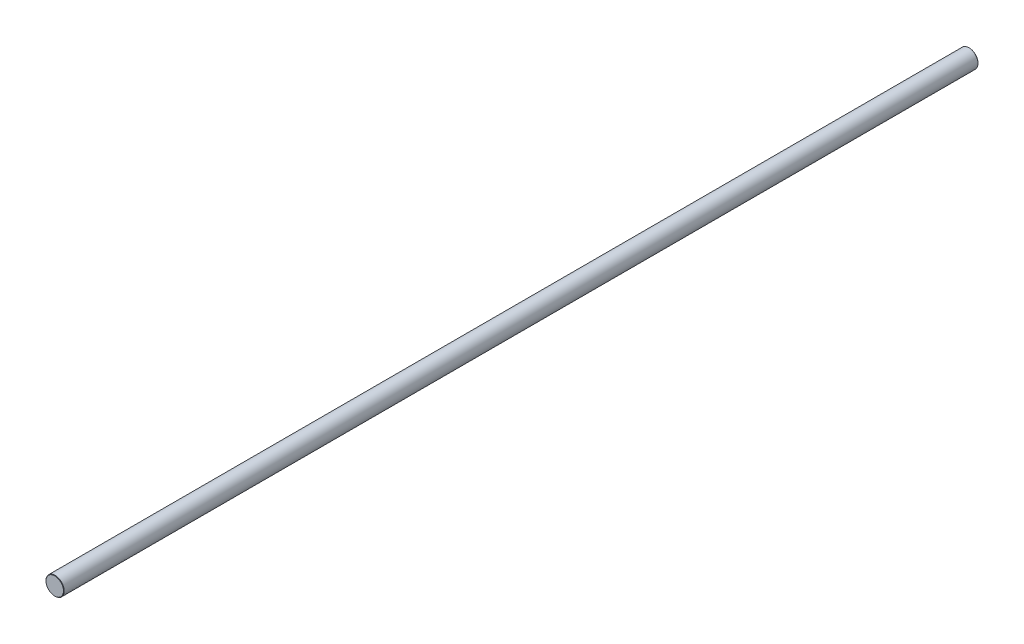
ISO-10303-21;
HEADER;
FILE_DESCRIPTION(('STEP AP214'),'2;1');
FILE_NAME('part.step','',(''),(''),'','','');
FILE_SCHEMA(('AUTOMOTIVE_DESIGN { 1 0 10303 214 1 1 1 1 }'));
ENDSEC;
DATA;
#1=APPLICATION_CONTEXT('core data for automotive mechanical design processes');
#2=APPLICATION_PROTOCOL_DEFINITION('international standard','automotive_design',2000,#1);
#3=PRODUCT_CONTEXT('',#1,'mechanical');
#4=PRODUCT('Part','Part','',(#3));
#5=PRODUCT_RELATED_PRODUCT_CATEGORY('part','',(#4));
#6=PRODUCT_DEFINITION_FORMATION('','',#4);
#7=PRODUCT_DEFINITION_CONTEXT('part definition',#1,'design');
#8=PRODUCT_DEFINITION('design','',#6,#7);
#9=PRODUCT_DEFINITION_SHAPE('','',#8);
#10=(LENGTH_UNIT() NAMED_UNIT(*) SI_UNIT(.MILLI.,.METRE.));
#11=(NAMED_UNIT(*) PLANE_ANGLE_UNIT() SI_UNIT($,.RADIAN.));
#12=(NAMED_UNIT(*) SI_UNIT($,.STERADIAN.) SOLID_ANGLE_UNIT());
#13=UNCERTAINTY_MEASURE_WITH_UNIT(LENGTH_MEASURE(1.E-05),#10,'distance_accuracy_value','');
#14=(GEOMETRIC_REPRESENTATION_CONTEXT(3) GLOBAL_UNCERTAINTY_ASSIGNED_CONTEXT((#13)) GLOBAL_UNIT_ASSIGNED_CONTEXT((#10,
#11,#12)) REPRESENTATION_CONTEXT('',''));
#15=CARTESIAN_POINT('',(0.,0.,0.));
#16=DIRECTION('',(0.,0.,1.));
#17=DIRECTION('',(1.,0.,0.));
#18=AXIS2_PLACEMENT_3D('',#15,#16,#17);
#19=CARTESIAN_POINT('',(0.,0.,1276.));
#20=DIRECTION('',(0.,0.,-1.));
#21=DIRECTION('',(-1.,0.,0.));
#22=AXIS2_PLACEMENT_3D('',#19,#20,#21);
#23=CYLINDRICAL_SURFACE('',#22,12.7);
#24=CARTESIAN_POINT('',(0.,0.,0.499999999999723));
#25=DIRECTION('',(0.,0.,1.));
#26=DIRECTION('',(1.,0.,0.));
#27=AXIS2_PLACEMENT_3D('',#24,#25,#26);
#28=CIRCLE('',#27,12.7);
#29=CARTESIAN_POINT('',(12.7,0.,0.499999999999723));
#30=VERTEX_POINT('',#29);
#31=EDGE_CURVE('E49',#30,#30,#28,.T.);
#32=ORIENTED_EDGE('',*,*,#31,.T.);
#33=EDGE_LOOP('',(#32));
#34=FACE_BOUND('',#33,.T.);
#35=CARTESIAN_POINT('',(0.,0.,1275.5));
#36=DIRECTION('',(0.,0.,1.));
#37=DIRECTION('',(1.,0.,0.));
#38=AXIS2_PLACEMENT_3D('',#35,#36,#37);
#39=CIRCLE('',#38,12.7);
#40=CARTESIAN_POINT('',(12.7,0.,1275.5));
#41=VERTEX_POINT('',#40);
#42=EDGE_CURVE('E53',#41,#41,#39,.F.);
#43=ORIENTED_EDGE('',*,*,#42,.T.);
#44=EDGE_LOOP('',(#43));
#45=FACE_BOUND('',#44,.T.);
#46=ADVANCED_FACE('F37',(#34,#45),#23,.T.);
#47=CARTESIAN_POINT('',(0.,0.,1276.));
#48=DIRECTION('',(0.,0.,1.));
#49=DIRECTION('',(1.,0.,0.));
#50=AXIS2_PLACEMENT_3D('',#47,#48,#49);
#51=PLANE('',#50);
#52=CARTESIAN_POINT('',(0.,0.,1276.));
#53=DIRECTION('',(0.,0.,1.));
#54=DIRECTION('',(1.,0.,0.));
#55=AXIS2_PLACEMENT_3D('',#52,#53,#54);
#56=CIRCLE('',#55,12.1999999999997);
#57=CARTESIAN_POINT('',(12.1999999999997,0.,1276.));
#58=VERTEX_POINT('',#57);
#59=EDGE_CURVE('E10',#58,#58,#56,.T.);
#60=ORIENTED_EDGE('',*,*,#59,.T.);
#61=EDGE_LOOP('',(#60));
#62=FACE_BOUND('',#61,.T.);
#63=ADVANCED_FACE('F69',(#62),#51,.T.);
#64=CARTESIAN_POINT('',(0.,0.,0.));
#65=DIRECTION('',(0.,0.,1.));
#66=DIRECTION('',(1.,0.,0.));
#67=AXIS2_PLACEMENT_3D('',#64,#65,#66);
#68=PLANE('',#67);
#69=CARTESIAN_POINT('',(0.,0.,0.));
#70=DIRECTION('',(0.,0.,1.));
#71=DIRECTION('',(1.,0.,0.));
#72=AXIS2_PLACEMENT_3D('',#69,#70,#71);
#73=CIRCLE('',#72,12.2000000000003);
#74=CARTESIAN_POINT('',(12.2000000000003,0.,0.));
#75=VERTEX_POINT('',#74);
#76=EDGE_CURVE('E45',#75,#75,#73,.F.);
#77=ORIENTED_EDGE('',*,*,#76,.T.);
#78=EDGE_LOOP('',(#77));
#79=FACE_BOUND('',#78,.T.);
#80=ADVANCED_FACE('F66',(#79),#68,.F.);
#81=CARTESIAN_POINT('',(0.,0.,0.499999999999723));
#82=DIRECTION('',(0.,0.,1.));
#83=DIRECTION('',(1.,0.,0.));
#84=AXIS2_PLACEMENT_3D('',#81,#82,#83);
#85=CONICAL_SURFACE('',#84,12.7,0.785398163397401);
#86=ORIENTED_EDGE('',*,*,#76,.F.);
#87=EDGE_LOOP('',(#86));
#88=FACE_BOUND('',#87,.T.);
#89=ORIENTED_EDGE('',*,*,#31,.F.);
#90=EDGE_LOOP('',(#89));
#91=FACE_BOUND('',#90,.T.);
#92=ADVANCED_FACE('F62',(#88,#91),#85,.T.);
#93=CARTESIAN_POINT('',(0.,0.,1276.));
#94=DIRECTION('',(0.,0.,-1.));
#95=DIRECTION('',(-1.,0.,0.));
#96=AXIS2_PLACEMENT_3D('',#93,#94,#95);
#97=CONICAL_SURFACE('',#96,12.1999999999997,0.785398163397403);
#98=ORIENTED_EDGE('',*,*,#42,.F.);
#99=EDGE_LOOP('',(#98));
#100=FACE_BOUND('',#99,.T.);
#101=ORIENTED_EDGE('',*,*,#59,.F.);
#102=EDGE_LOOP('',(#101));
#103=FACE_BOUND('',#102,.T.);
#104=ADVANCED_FACE('F40',(#100,#103),#97,.T.);
#105=CLOSED_SHELL('',(#46,#63,#80,#92,#104));
#106=MANIFOLD_SOLID_BREP('B2',#105);
#107=ADVANCED_BREP_SHAPE_REPRESENTATION('',(#18,#106),#14);
#108=SHAPE_DEFINITION_REPRESENTATION(#9,#107);
ENDSEC;
END-ISO-10303-21;
